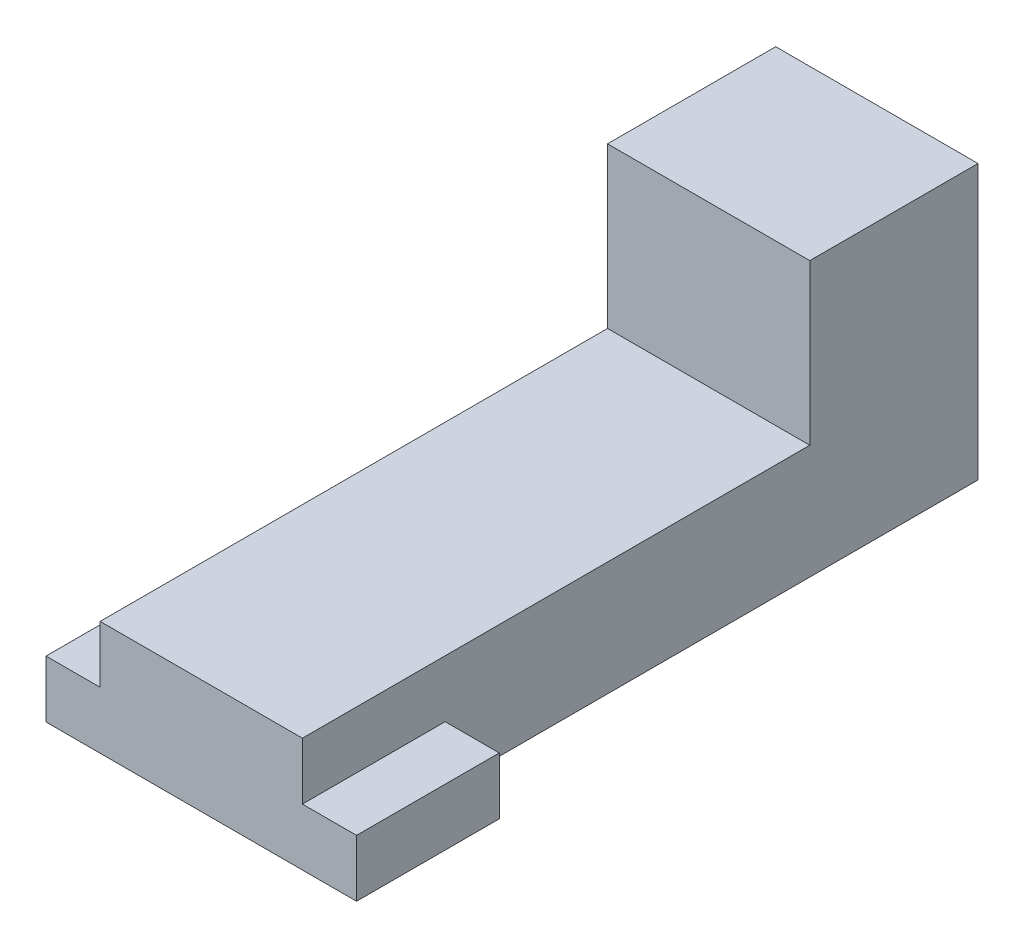
ISO-10303-21;
HEADER;
FILE_DESCRIPTION(('STEP AP214'),'2;1');
FILE_NAME('part.step','',(''),(''),'','','');
FILE_SCHEMA(('AUTOMOTIVE_DESIGN { 1 0 10303 214 1 1 1 1 }'));
ENDSEC;
DATA;
#1=APPLICATION_CONTEXT('core data for automotive mechanical design processes');
#2=APPLICATION_PROTOCOL_DEFINITION('international standard','automotive_design',2000,#1);
#3=PRODUCT_CONTEXT('',#1,'mechanical');
#4=PRODUCT('Part','Part','',(#3));
#5=PRODUCT_RELATED_PRODUCT_CATEGORY('part','',(#4));
#6=PRODUCT_DEFINITION_FORMATION('','',#4);
#7=PRODUCT_DEFINITION_CONTEXT('part definition',#1,'design');
#8=PRODUCT_DEFINITION('design','',#6,#7);
#9=PRODUCT_DEFINITION_SHAPE('','',#8);
#10=(LENGTH_UNIT() NAMED_UNIT(*) SI_UNIT(.MILLI.,.METRE.));
#11=(NAMED_UNIT(*) PLANE_ANGLE_UNIT() SI_UNIT($,.RADIAN.));
#12=(NAMED_UNIT(*) SI_UNIT($,.STERADIAN.) SOLID_ANGLE_UNIT());
#13=UNCERTAINTY_MEASURE_WITH_UNIT(LENGTH_MEASURE(1.E-05),#10,'distance_accuracy_value','');
#14=(GEOMETRIC_REPRESENTATION_CONTEXT(3) GLOBAL_UNCERTAINTY_ASSIGNED_CONTEXT((#13)) GLOBAL_UNIT_ASSIGNED_CONTEXT((#10,
#11,#12)) REPRESENTATION_CONTEXT('',''));
#15=CARTESIAN_POINT('',(0.,0.,0.));
#16=DIRECTION('',(0.,0.,1.));
#17=DIRECTION('',(1.,0.,0.));
#18=AXIS2_PLACEMENT_3D('',#15,#16,#17);
#19=CARTESIAN_POINT('',(-679.795,125.,625.));
#20=DIRECTION('',(0.,-1.,0.));
#21=DIRECTION('',(0.,0.,-1.));
#22=AXIS2_PLACEMENT_3D('',#19,#20,#21);
#23=PLANE('',#22);
#24=DIRECTION('',(-1.,0.,0.));
#25=VECTOR('',#24,1.);
#26=CARTESIAN_POINT('',(-679.795,125.,0.));
#27=LINE('',#26,#25);
#28=CARTESIAN_POINT('',(679.795,125.,0.));
#29=VERTEX_POINT('',#28);
#30=CARTESIAN_POINT('',(442.8,125.,0.));
#31=VERTEX_POINT('',#30);
#32=EDGE_CURVE('E197',#29,#31,#27,.T.);
#33=ORIENTED_EDGE('',*,*,#32,.T.);
#34=DIRECTION('',(0.,0.,1.));
#35=VECTOR('',#34,1.);
#36=CARTESIAN_POINT('',(442.8,125.,625.));
#37=LINE('',#36,#35);
#38=CARTESIAN_POINT('',(442.8,125.,625.));
#39=VERTEX_POINT('',#38);
#40=EDGE_CURVE('E177',#31,#39,#37,.T.);
#41=ORIENTED_EDGE('',*,*,#40,.T.);
#42=DIRECTION('',(-1.,0.,0.));
#43=VECTOR('',#42,1.);
#44=CARTESIAN_POINT('',(-679.795,125.,625.));
#45=LINE('',#44,#43);
#46=CARTESIAN_POINT('',(679.795,125.,625.));
#47=VERTEX_POINT('',#46);
#48=EDGE_CURVE('E186',#47,#39,#45,.T.);
#49=ORIENTED_EDGE('',*,*,#48,.F.);
#50=DIRECTION('',(0.,0.,-1.));
#51=VECTOR('',#50,1.);
#52=CARTESIAN_POINT('',(679.795,125.,625.));
#53=LINE('',#52,#51);
#54=EDGE_CURVE('E213',#47,#29,#53,.T.);
#55=ORIENTED_EDGE('',*,*,#54,.T.);
#56=EDGE_LOOP('',(#33,#41,#49,#55));
#57=FACE_BOUND('',#56,.T.);
#58=ADVANCED_FACE('F33',(#57),#23,.F.);
#59=CARTESIAN_POINT('',(0.,0.,0.));
#60=DIRECTION('',(0.,0.,1.));
#61=DIRECTION('',(1.,0.,0.));
#62=AXIS2_PLACEMENT_3D('',#59,#60,#61);
#63=PLANE('',#62);
#64=DIRECTION('',(1.,0.,0.));
#65=VECTOR('',#64,1.);
#66=CARTESIAN_POINT('',(-679.795,-125.,0.));
#67=LINE('',#66,#65);
#68=CARTESIAN_POINT('',(442.8,-125.,0.));
#69=VERTEX_POINT('',#68);
#70=CARTESIAN_POINT('',(679.795,-125.,0.));
#71=VERTEX_POINT('',#70);
#72=EDGE_CURVE('E202',#69,#71,#67,.T.);
#73=ORIENTED_EDGE('',*,*,#72,.F.);
#74=DIRECTION('',(0.,1.,0.));
#75=VECTOR('',#74,1.);
#76=CARTESIAN_POINT('',(442.8,0.,0.));
#77=LINE('',#76,#75);
#78=EDGE_CURVE('E11',#69,#31,#77,.T.);
#79=ORIENTED_EDGE('',*,*,#78,.T.);
#80=ORIENTED_EDGE('',*,*,#32,.F.);
#81=DIRECTION('',(0.,1.,0.));
#82=VECTOR('',#81,1.);
#83=CARTESIAN_POINT('',(679.795,125.,0.));
#84=LINE('',#83,#82);
#85=EDGE_CURVE('E180',#71,#29,#84,.T.);
#86=ORIENTED_EDGE('',*,*,#85,.F.);
#87=EDGE_LOOP('',(#73,#79,#80,#86));
#88=FACE_BOUND('',#87,.T.);
#89=ADVANCED_FACE('F248',(#88),#63,.F.);
#90=CARTESIAN_POINT('',(679.795,125.,625.));
#91=DIRECTION('',(-1.,0.,0.));
#92=DIRECTION('',(0.,-1.,0.));
#93=AXIS2_PLACEMENT_3D('',#90,#91,#92);
#94=PLANE('',#93);
#95=ORIENTED_EDGE('',*,*,#85,.T.);
#96=ORIENTED_EDGE('',*,*,#54,.F.);
#97=DIRECTION('',(0.,1.,0.));
#98=VECTOR('',#97,1.);
#99=CARTESIAN_POINT('',(679.795,125.,625.));
#100=LINE('',#99,#98);
#101=CARTESIAN_POINT('',(679.795,-125.,625.));
#102=VERTEX_POINT('',#101);
#103=EDGE_CURVE('E181',#102,#47,#100,.T.);
#104=ORIENTED_EDGE('',*,*,#103,.F.);
#105=DIRECTION('',(0.,0.,-1.));
#106=VECTOR('',#105,1.);
#107=CARTESIAN_POINT('',(679.795,-125.,625.));
#108=LINE('',#107,#106);
#109=EDGE_CURVE('E193',#102,#71,#108,.T.);
#110=ORIENTED_EDGE('',*,*,#109,.T.);
#111=EDGE_LOOP('',(#95,#96,#104,#110));
#112=FACE_BOUND('',#111,.T.);
#113=ADVANCED_FACE('F35',(#112),#94,.F.);
#114=CARTESIAN_POINT('',(-442.8,125.,625.));
#115=VERTEX_POINT('',#114);
#116=CARTESIAN_POINT('',(-679.795,125.,625.));
#117=VERTEX_POINT('',#116);
#118=EDGE_CURVE('E184',#115,#117,#45,.T.);
#119=ORIENTED_EDGE('',*,*,#118,.F.);
#120=DIRECTION('',(0.,0.,-1.));
#121=VECTOR('',#120,1.);
#122=CARTESIAN_POINT('',(-442.8,125.,625.));
#123=LINE('',#122,#121);
#124=CARTESIAN_POINT('',(-442.8,125.,0.));
#125=VERTEX_POINT('',#124);
#126=EDGE_CURVE('E174',#115,#125,#123,.T.);
#127=ORIENTED_EDGE('',*,*,#126,.T.);
#128=CARTESIAN_POINT('',(-679.795,125.,0.));
#129=VERTEX_POINT('',#128);
#130=EDGE_CURVE('E196',#125,#129,#27,.T.);
#131=ORIENTED_EDGE('',*,*,#130,.T.);
#132=DIRECTION('',(0.,0.,-1.));
#133=VECTOR('',#132,1.);
#134=CARTESIAN_POINT('',(-679.795,125.,625.));
#135=LINE('',#134,#133);
#136=EDGE_CURVE('E210',#117,#129,#135,.T.);
#137=ORIENTED_EDGE('',*,*,#136,.F.);
#138=EDGE_LOOP('',(#119,#127,#131,#137));
#139=FACE_BOUND('',#138,.T.);
#140=ADVANCED_FACE('F231',(#139),#23,.F.);
#141=CARTESIAN_POINT('',(-679.795,125.,625.));
#142=DIRECTION('',(1.,0.,0.));
#143=DIRECTION('',(0.,1.,0.));
#144=AXIS2_PLACEMENT_3D('',#141,#142,#143);
#145=PLANE('',#144);
#146=DIRECTION('',(0.,-1.,0.));
#147=VECTOR('',#146,1.);
#148=CARTESIAN_POINT('',(-679.795,125.,0.));
#149=LINE('',#148,#147);
#150=CARTESIAN_POINT('',(-679.795,-125.,0.));
#151=VERTEX_POINT('',#150);
#152=EDGE_CURVE('E200',#129,#151,#149,.T.);
#153=ORIENTED_EDGE('',*,*,#152,.T.);
#154=DIRECTION('',(0.,0.,-1.));
#155=VECTOR('',#154,1.);
#156=CARTESIAN_POINT('',(-679.795,-125.,625.));
#157=LINE('',#156,#155);
#158=CARTESIAN_POINT('',(-679.795,-125.,625.));
#159=VERTEX_POINT('',#158);
#160=EDGE_CURVE('E207',#159,#151,#157,.T.);
#161=ORIENTED_EDGE('',*,*,#160,.F.);
#162=DIRECTION('',(0.,-1.,0.));
#163=VECTOR('',#162,1.);
#164=CARTESIAN_POINT('',(-679.795,125.,625.));
#165=LINE('',#164,#163);
#166=EDGE_CURVE('E189',#117,#159,#165,.T.);
#167=ORIENTED_EDGE('',*,*,#166,.F.);
#168=ORIENTED_EDGE('',*,*,#136,.T.);
#169=EDGE_LOOP('',(#153,#161,#167,#168));
#170=FACE_BOUND('',#169,.T.);
#171=ADVANCED_FACE('F227',(#170),#145,.F.);
#172=CARTESIAN_POINT('',(-679.795,-125.,625.));
#173=DIRECTION('',(0.,1.,0.));
#174=DIRECTION('',(0.,0.,1.));
#175=AXIS2_PLACEMENT_3D('',#172,#173,#174);
#176=PLANE('',#175);
#177=CARTESIAN_POINT('',(-442.8,-125.,0.));
#178=VERTEX_POINT('',#177);
#179=EDGE_CURVE('E185',#151,#178,#67,.T.);
#180=ORIENTED_EDGE('',*,*,#179,.T.);
#181=DIRECTION('',(0.,0.,1.));
#182=VECTOR('',#181,1.);
#183=CARTESIAN_POINT('',(-442.8,-125.,-3349.86919370666));
#184=LINE('',#183,#182);
#185=CARTESIAN_POINT('',(-442.8,-125.,-2332.87));
#186=VERTEX_POINT('',#185);
#187=EDGE_CURVE('E56',#186,#178,#184,.T.);
#188=ORIENTED_EDGE('',*,*,#187,.F.);
#189=DIRECTION('',(1.,0.,0.));
#190=VECTOR('',#189,1.);
#191=CARTESIAN_POINT('',(442.8,-125.,-2332.87));
#192=LINE('',#191,#190);
#193=CARTESIAN_POINT('',(442.8,-125.,-2332.87));
#194=VERTEX_POINT('',#193);
#195=EDGE_CURVE('E161',#186,#194,#192,.T.);
#196=ORIENTED_EDGE('',*,*,#195,.T.);
#197=DIRECTION('',(0.,0.,1.));
#198=VECTOR('',#197,1.);
#199=CARTESIAN_POINT('',(442.8,-125.,-3349.86919370666));
#200=LINE('',#199,#198);
#201=EDGE_CURVE('E130',#194,#69,#200,.T.);
#202=ORIENTED_EDGE('',*,*,#201,.T.);
#203=ORIENTED_EDGE('',*,*,#72,.T.);
#204=ORIENTED_EDGE('',*,*,#109,.F.);
#205=DIRECTION('',(1.,0.,0.));
#206=VECTOR('',#205,1.);
#207=CARTESIAN_POINT('',(-679.795,-125.,625.));
#208=LINE('',#207,#206);
#209=EDGE_CURVE('E191',#159,#102,#208,.T.);
#210=ORIENTED_EDGE('',*,*,#209,.F.);
#211=ORIENTED_EDGE('',*,*,#160,.T.);
#212=EDGE_LOOP('',(#180,#188,#196,#202,#203,#204,#210,#211));
#213=FACE_BOUND('',#212,.T.);
#214=ADVANCED_FACE('F221',(#213),#176,.F.);
#215=CARTESIAN_POINT('',(0.,0.,625.));
#216=DIRECTION('',(0.,0.,1.));
#217=DIRECTION('',(1.,0.,0.));
#218=AXIS2_PLACEMENT_3D('',#215,#216,#217);
#219=PLANE('',#218);
#220=ORIENTED_EDGE('',*,*,#209,.T.);
#221=ORIENTED_EDGE('',*,*,#103,.T.);
#222=ORIENTED_EDGE('',*,*,#48,.T.);
#223=DIRECTION('',(0.,1.,0.));
#224=VECTOR('',#223,1.);
#225=CARTESIAN_POINT('',(442.8,375.,625.));
#226=LINE('',#225,#224);
#227=CARTESIAN_POINT('',(442.8,375.,625.));
#228=VERTEX_POINT('',#227);
#229=EDGE_CURVE('E162',#39,#228,#226,.T.);
#230=ORIENTED_EDGE('',*,*,#229,.T.);
#231=DIRECTION('',(-1.,0.,0.));
#232=VECTOR('',#231,1.);
#233=CARTESIAN_POINT('',(442.8,375.,625.));
#234=LINE('',#233,#232);
#235=CARTESIAN_POINT('',(-442.8,375.,625.));
#236=VERTEX_POINT('',#235);
#237=EDGE_CURVE('E158',#228,#236,#234,.T.);
#238=ORIENTED_EDGE('',*,*,#237,.T.);
#239=DIRECTION('',(0.,-1.,0.));
#240=VECTOR('',#239,1.);
#241=CARTESIAN_POINT('',(-442.8,375.,625.));
#242=LINE('',#241,#240);
#243=EDGE_CURVE('E157',#236,#115,#242,.T.);
#244=ORIENTED_EDGE('',*,*,#243,.T.);
#245=ORIENTED_EDGE('',*,*,#118,.T.);
#246=ORIENTED_EDGE('',*,*,#166,.T.);
#247=EDGE_LOOP('',(#220,#221,#222,#230,#238,#244,#245,#246));
#248=FACE_BOUND('',#247,.T.);
#249=ADVANCED_FACE('F235',(#248),#219,.T.);
#250=ORIENTED_EDGE('',*,*,#130,.F.);
#251=DIRECTION('',(0.,-1.,0.));
#252=VECTOR('',#251,1.);
#253=CARTESIAN_POINT('',(-442.8,0.,0.));
#254=LINE('',#253,#252);
#255=EDGE_CURVE('E41',#125,#178,#254,.T.);
#256=ORIENTED_EDGE('',*,*,#255,.T.);
#257=ORIENTED_EDGE('',*,*,#179,.F.);
#258=ORIENTED_EDGE('',*,*,#152,.F.);
#259=EDGE_LOOP('',(#250,#256,#257,#258));
#260=FACE_BOUND('',#259,.T.);
#261=ADVANCED_FACE('F218',(#260),#63,.F.);
#262=CARTESIAN_POINT('',(442.8,375.,-3349.86919370666));
#263=DIRECTION('',(1.,0.,0.));
#264=DIRECTION('',(0.,0.,-1.));
#265=AXIS2_PLACEMENT_3D('',#262,#263,#264);
#266=PLANE('',#265);
#267=ORIENTED_EDGE('',*,*,#40,.F.);
#268=ORIENTED_EDGE('',*,*,#78,.F.);
#269=ORIENTED_EDGE('',*,*,#201,.F.);
#270=DIRECTION('',(0.,1.,0.));
#271=VECTOR('',#270,1.);
#272=CARTESIAN_POINT('',(442.8,375.,-2332.87));
#273=LINE('',#272,#271);
#274=CARTESIAN_POINT('',(442.8,1075.,-2332.87));
#275=VERTEX_POINT('',#274);
#276=EDGE_CURVE('E123',#194,#275,#273,.T.);
#277=ORIENTED_EDGE('',*,*,#276,.T.);
#278=DIRECTION('',(0.,0.,-1.));
#279=VECTOR('',#278,1.);
#280=CARTESIAN_POINT('',(442.8,1075.,-2332.87));
#281=LINE('',#280,#279);
#282=CARTESIAN_POINT('',(442.8,1075.,-1596.39000000001));
#283=VERTEX_POINT('',#282);
#284=EDGE_CURVE('E128',#283,#275,#281,.T.);
#285=ORIENTED_EDGE('',*,*,#284,.F.);
#286=DIRECTION('',(0.,-1.,0.));
#287=VECTOR('',#286,1.);
#288=CARTESIAN_POINT('',(442.8,1075.,-1596.39000000001));
#289=LINE('',#288,#287);
#290=CARTESIAN_POINT('',(442.8,375.,-1596.39000000001));
#291=VERTEX_POINT('',#290);
#292=EDGE_CURVE('E151',#283,#291,#289,.T.);
#293=ORIENTED_EDGE('',*,*,#292,.T.);
#294=DIRECTION('',(0.,0.,1.));
#295=VECTOR('',#294,1.);
#296=CARTESIAN_POINT('',(442.8,375.,-3349.86919370666));
#297=LINE('',#296,#295);
#298=EDGE_CURVE('E133',#291,#228,#297,.T.);
#299=ORIENTED_EDGE('',*,*,#298,.T.);
#300=ORIENTED_EDGE('',*,*,#229,.F.);
#301=EDGE_LOOP('',(#267,#268,#269,#277,#285,#293,#299,#300));
#302=FACE_BOUND('',#301,.T.);
#303=ADVANCED_FACE('F125',(#302),#266,.T.);
#304=CARTESIAN_POINT('',(-442.8,375.,-3349.86919370666));
#305=DIRECTION('',(-1.,0.,0.));
#306=DIRECTION('',(0.,-1.,0.));
#307=AXIS2_PLACEMENT_3D('',#304,#305,#306);
#308=PLANE('',#307);
#309=ORIENTED_EDGE('',*,*,#126,.F.);
#310=ORIENTED_EDGE('',*,*,#243,.F.);
#311=DIRECTION('',(0.,0.,1.));
#312=VECTOR('',#311,1.);
#313=CARTESIAN_POINT('',(-442.8,375.,-3349.86919370666));
#314=LINE('',#313,#312);
#315=CARTESIAN_POINT('',(-442.8,375.,-1596.39000000001));
#316=VERTEX_POINT('',#315);
#317=EDGE_CURVE('E168',#316,#236,#314,.T.);
#318=ORIENTED_EDGE('',*,*,#317,.F.);
#319=DIRECTION('',(0.,-1.,0.));
#320=VECTOR('',#319,1.);
#321=CARTESIAN_POINT('',(-442.8,1075.,-1596.39000000001));
#322=LINE('',#321,#320);
#323=CARTESIAN_POINT('',(-442.8,1075.,-1596.39000000001));
#324=VERTEX_POINT('',#323);
#325=EDGE_CURVE('E154',#324,#316,#322,.T.);
#326=ORIENTED_EDGE('',*,*,#325,.F.);
#327=DIRECTION('',(0.,0.,1.));
#328=VECTOR('',#327,1.);
#329=CARTESIAN_POINT('',(-442.8,1075.,-2332.87));
#330=LINE('',#329,#328);
#331=CARTESIAN_POINT('',(-442.8,1075.,-2332.87));
#332=VERTEX_POINT('',#331);
#333=EDGE_CURVE('E141',#332,#324,#330,.T.);
#334=ORIENTED_EDGE('',*,*,#333,.F.);
#335=DIRECTION('',(0.,-1.,0.));
#336=VECTOR('',#335,1.);
#337=CARTESIAN_POINT('',(-442.8,375.,-2332.87));
#338=LINE('',#337,#336);
#339=EDGE_CURVE('E138',#332,#186,#338,.T.);
#340=ORIENTED_EDGE('',*,*,#339,.T.);
#341=ORIENTED_EDGE('',*,*,#187,.T.);
#342=ORIENTED_EDGE('',*,*,#255,.F.);
#343=EDGE_LOOP('',(#309,#310,#318,#326,#334,#340,#341,#342));
#344=FACE_BOUND('',#343,.T.);
#345=ADVANCED_FACE('F233',(#344),#308,.T.);
#346=CARTESIAN_POINT('',(4.15500000000017,-125.000000000567,-2332.87));
#347=DIRECTION('',(0.,0.,-1.));
#348=DIRECTION('',(-1.,0.,0.));
#349=AXIS2_PLACEMENT_3D('',#346,#347,#348);
#350=PLANE('',#349);
#351=ORIENTED_EDGE('',*,*,#339,.F.);
#352=DIRECTION('',(-1.,0.,0.));
#353=VECTOR('',#352,1.);
#354=CARTESIAN_POINT('',(-442.8,1075.,-2332.87));
#355=LINE('',#354,#353);
#356=EDGE_CURVE('E136',#275,#332,#355,.T.);
#357=ORIENTED_EDGE('',*,*,#356,.F.);
#358=ORIENTED_EDGE('',*,*,#276,.F.);
#359=ORIENTED_EDGE('',*,*,#195,.F.);
#360=EDGE_LOOP('',(#351,#357,#358,#359));
#361=FACE_BOUND('',#360,.T.);
#362=ADVANCED_FACE('F137',(#361),#350,.T.);
#363=CARTESIAN_POINT('',(442.8,375.,-3349.86919370666));
#364=DIRECTION('',(0.,1.,0.));
#365=DIRECTION('',(-1.,0.,0.));
#366=AXIS2_PLACEMENT_3D('',#363,#364,#365);
#367=PLANE('',#366);
#368=DIRECTION('',(1.,0.,0.));
#369=VECTOR('',#368,1.);
#370=CARTESIAN_POINT('',(-442.8,375.,-1596.39000000001));
#371=LINE('',#370,#369);
#372=EDGE_CURVE('E48',#316,#291,#371,.T.);
#373=ORIENTED_EDGE('',*,*,#372,.F.);
#374=ORIENTED_EDGE('',*,*,#317,.T.);
#375=ORIENTED_EDGE('',*,*,#237,.F.);
#376=ORIENTED_EDGE('',*,*,#298,.F.);
#377=EDGE_LOOP('',(#373,#374,#375,#376));
#378=FACE_BOUND('',#377,.T.);
#379=ADVANCED_FACE('F237',(#378),#367,.T.);
#380=CARTESIAN_POINT('',(-442.8,1075.,-1596.39000000001));
#381=DIRECTION('',(0.,0.,-1.));
#382=DIRECTION('',(-1.,0.,0.));
#383=AXIS2_PLACEMENT_3D('',#380,#381,#382);
#384=PLANE('',#383);
#385=ORIENTED_EDGE('',*,*,#372,.T.);
#386=ORIENTED_EDGE('',*,*,#292,.F.);
#387=DIRECTION('',(1.,0.,0.));
#388=VECTOR('',#387,1.);
#389=CARTESIAN_POINT('',(-442.8,1075.,-1596.39000000001));
#390=LINE('',#389,#388);
#391=EDGE_CURVE('E145',#324,#283,#390,.T.);
#392=ORIENTED_EDGE('',*,*,#391,.F.);
#393=ORIENTED_EDGE('',*,*,#325,.T.);
#394=EDGE_LOOP('',(#385,#386,#392,#393));
#395=FACE_BOUND('',#394,.T.);
#396=ADVANCED_FACE('F240',(#395),#384,.F.);
#397=CARTESIAN_POINT('',(-2.02149348149059E-13,1075.,0.));
#398=DIRECTION('',(0.,1.,0.));
#399=DIRECTION('',(-1.,0.,0.));
#400=AXIS2_PLACEMENT_3D('',#397,#398,#399);
#401=PLANE('',#400);
#402=ORIENTED_EDGE('',*,*,#284,.T.);
#403=ORIENTED_EDGE('',*,*,#356,.T.);
#404=ORIENTED_EDGE('',*,*,#333,.T.);
#405=ORIENTED_EDGE('',*,*,#391,.T.);
#406=EDGE_LOOP('',(#402,#403,#404,#405));
#407=FACE_BOUND('',#406,.T.);
#408=ADVANCED_FACE('F143',(#407),#401,.T.);
#409=CLOSED_SHELL('',(#58,#89,#113,#140,#171,#214,#249,#261,#303,#345,#362,#379,#396,#408));
#410=MANIFOLD_SOLID_BREP('B2',#409);
#411=ADVANCED_BREP_SHAPE_REPRESENTATION('',(#18,#410),#14);
#412=SHAPE_DEFINITION_REPRESENTATION(#9,#411);
ENDSEC;
END-ISO-10303-21;
